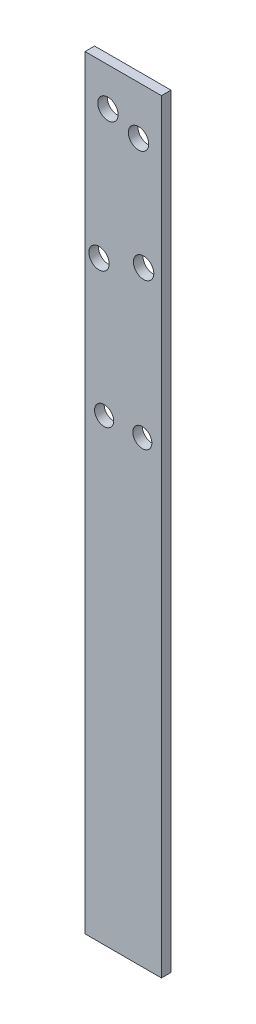
ISO-10303-21;
HEADER;
FILE_DESCRIPTION(('STEP AP214'),'2;1');
FILE_NAME('part.step','',(''),(''),'','','');
FILE_SCHEMA(('AUTOMOTIVE_DESIGN { 1 0 10303 214 1 1 1 1 }'));
ENDSEC;
DATA;
#1=APPLICATION_CONTEXT('core data for automotive mechanical design processes');
#2=APPLICATION_PROTOCOL_DEFINITION('international standard','automotive_design',2000,#1);
#3=PRODUCT_CONTEXT('',#1,'mechanical');
#4=PRODUCT('Part','Part','',(#3));
#5=PRODUCT_RELATED_PRODUCT_CATEGORY('part','',(#4));
#6=PRODUCT_DEFINITION_FORMATION('','',#4);
#7=PRODUCT_DEFINITION_CONTEXT('part definition',#1,'design');
#8=PRODUCT_DEFINITION('design','',#6,#7);
#9=PRODUCT_DEFINITION_SHAPE('','',#8);
#10=(LENGTH_UNIT() NAMED_UNIT(*) SI_UNIT(.MILLI.,.METRE.));
#11=(NAMED_UNIT(*) PLANE_ANGLE_UNIT() SI_UNIT($,.RADIAN.));
#12=(NAMED_UNIT(*) SI_UNIT($,.STERADIAN.) SOLID_ANGLE_UNIT());
#13=UNCERTAINTY_MEASURE_WITH_UNIT(LENGTH_MEASURE(1.E-05),#10,'distance_accuracy_value','');
#14=(GEOMETRIC_REPRESENTATION_CONTEXT(3) GLOBAL_UNCERTAINTY_ASSIGNED_CONTEXT((#13)) GLOBAL_UNIT_ASSIGNED_CONTEXT((#10,
#11,#12)) REPRESENTATION_CONTEXT('',''));
#15=CARTESIAN_POINT('',(0.,0.,0.));
#16=DIRECTION('',(0.,0.,1.));
#17=DIRECTION('',(1.,0.,0.));
#18=AXIS2_PLACEMENT_3D('',#15,#16,#17);
#19=CARTESIAN_POINT('',(0.,0.,4.7625));
#20=DIRECTION('',(0.,0.,1.));
#21=DIRECTION('',(1.,0.,0.));
#22=AXIS2_PLACEMENT_3D('',#19,#20,#21);
#23=PLANE('',#22);
#24=CARTESIAN_POINT('',(6.98500000000002,-85.725,4.7625));
#25=DIRECTION('',(0.,0.,1.));
#26=DIRECTION('',(1.,0.,0.));
#27=AXIS2_PLACEMENT_3D('',#24,#25,#26);
#28=CIRCLE('',#27,5.08000000000001);
#29=CARTESIAN_POINT('',(1.90500000000002,-85.725,4.7625));
#30=VERTEX_POINT('',#29);
#31=EDGE_CURVE('E162',#30,#30,#28,.T.);
#32=ORIENTED_EDGE('',*,*,#31,.F.);
#33=EDGE_LOOP('',(#32));
#34=FACE_BOUND('',#33,.T.);
#35=CARTESIAN_POINT('',(11.43,-19.05,4.7625));
#36=DIRECTION('',(0.,0.,1.));
#37=DIRECTION('',(1.,0.,0.));
#38=AXIS2_PLACEMENT_3D('',#35,#36,#37);
#39=CIRCLE('',#38,5.08);
#40=CARTESIAN_POINT('',(6.35,-19.05,4.7625));
#41=VERTEX_POINT('',#40);
#42=EDGE_CURVE('E146',#41,#41,#39,.T.);
#43=ORIENTED_EDGE('',*,*,#42,.F.);
#44=EDGE_LOOP('',(#43));
#45=FACE_BOUND('',#44,.T.);
#46=CARTESIAN_POINT('',(9.52500000000001,-152.4,4.7625));
#47=DIRECTION('',(0.,0.,1.));
#48=DIRECTION('',(1.,0.,0.));
#49=AXIS2_PLACEMENT_3D('',#46,#47,#48);
#50=CIRCLE('',#49,4.7625);
#51=CARTESIAN_POINT('',(4.76250000000001,-152.4,4.7625));
#52=VERTEX_POINT('',#51);
#53=EDGE_CURVE('E116',#52,#52,#50,.T.);
#54=ORIENTED_EDGE('',*,*,#53,.F.);
#55=EDGE_LOOP('',(#54));
#56=FACE_BOUND('',#55,.T.);
#57=DIRECTION('',(0.,-1.,0.));
#58=VECTOR('',#57,1.);
#59=CARTESIAN_POINT('',(0.,0.,4.7625));
#60=LINE('',#59,#58);
#61=CARTESIAN_POINT('',(0.,0.,4.7625));
#62=VERTEX_POINT('',#61);
#63=CARTESIAN_POINT('',(0.,-381.,4.7625));
#64=VERTEX_POINT('',#63);
#65=EDGE_CURVE('E96',#62,#64,#60,.T.);
#66=ORIENTED_EDGE('',*,*,#65,.T.);
#67=DIRECTION('',(1.,0.,0.));
#68=VECTOR('',#67,1.);
#69=CARTESIAN_POINT('',(0.,-381.,4.7625));
#70=LINE('',#69,#68);
#71=CARTESIAN_POINT('',(38.1000000000001,-381.,4.7625));
#72=VERTEX_POINT('',#71);
#73=EDGE_CURVE('E91',#64,#72,#70,.T.);
#74=ORIENTED_EDGE('',*,*,#73,.T.);
#75=DIRECTION('',(0.,1.,0.));
#76=VECTOR('',#75,1.);
#77=CARTESIAN_POINT('',(38.1,0.,4.7625));
#78=LINE('',#77,#76);
#79=CARTESIAN_POINT('',(38.1,0.,4.7625));
#80=VERTEX_POINT('',#79);
#81=EDGE_CURVE('E94',#72,#80,#78,.T.);
#82=ORIENTED_EDGE('',*,*,#81,.T.);
#83=DIRECTION('',(-1.,0.,0.));
#84=VECTOR('',#83,1.);
#85=CARTESIAN_POINT('',(0.,0.,4.7625));
#86=LINE('',#85,#84);
#87=EDGE_CURVE('E61',#80,#62,#86,.T.);
#88=ORIENTED_EDGE('',*,*,#87,.T.);
#89=EDGE_LOOP('',(#66,#74,#82,#88));
#90=FACE_BOUND('',#89,.T.);
#91=CARTESIAN_POINT('',(28.575,-152.4,4.7625));
#92=DIRECTION('',(0.,0.,1.));
#93=DIRECTION('',(1.,0.,0.));
#94=AXIS2_PLACEMENT_3D('',#91,#92,#93);
#95=CIRCLE('',#94,4.7625);
#96=CARTESIAN_POINT('',(23.8125,-152.4,4.7625));
#97=VERTEX_POINT('',#96);
#98=EDGE_CURVE('E138',#97,#97,#95,.T.);
#99=ORIENTED_EDGE('',*,*,#98,.F.);
#100=EDGE_LOOP('',(#99));
#101=FACE_BOUND('',#100,.T.);
#102=CARTESIAN_POINT('',(26.67,-24.13,4.7625));
#103=DIRECTION('',(0.,0.,1.));
#104=DIRECTION('',(1.,0.,0.));
#105=AXIS2_PLACEMENT_3D('',#102,#103,#104);
#106=CIRCLE('',#105,5.08);
#107=CARTESIAN_POINT('',(21.59,-24.13,4.7625));
#108=VERTEX_POINT('',#107);
#109=EDGE_CURVE('E154',#108,#108,#106,.T.);
#110=ORIENTED_EDGE('',*,*,#109,.F.);
#111=EDGE_LOOP('',(#110));
#112=FACE_BOUND('',#111,.T.);
#113=CARTESIAN_POINT('',(29.21,-78.74,4.7625));
#114=DIRECTION('',(0.,0.,1.));
#115=DIRECTION('',(1.,0.,0.));
#116=AXIS2_PLACEMENT_3D('',#113,#114,#115);
#117=CIRCLE('',#116,5.08000000000001);
#118=CARTESIAN_POINT('',(24.13,-78.74,4.7625));
#119=VERTEX_POINT('',#118);
#120=EDGE_CURVE('E170',#119,#119,#117,.T.);
#121=ORIENTED_EDGE('',*,*,#120,.F.);
#122=EDGE_LOOP('',(#121));
#123=FACE_BOUND('',#122,.T.);
#124=ADVANCED_FACE('F43',(#34,#45,#56,#90,#101,#112,#123),#23,.T.);
#125=CARTESIAN_POINT('',(0.,0.,0.));
#126=DIRECTION('',(0.,0.,1.));
#127=DIRECTION('',(1.,0.,0.));
#128=AXIS2_PLACEMENT_3D('',#125,#126,#127);
#129=PLANE('',#128);
#130=DIRECTION('',(0.,-1.,0.));
#131=VECTOR('',#130,1.);
#132=CARTESIAN_POINT('',(0.,0.,0.));
#133=LINE('',#132,#131);
#134=CARTESIAN_POINT('',(0.,0.,0.));
#135=VERTEX_POINT('',#134);
#136=CARTESIAN_POINT('',(0.,-381.,0.));
#137=VERTEX_POINT('',#136);
#138=EDGE_CURVE('E112',#135,#137,#133,.T.);
#139=ORIENTED_EDGE('',*,*,#138,.F.);
#140=DIRECTION('',(-1.,0.,0.));
#141=VECTOR('',#140,1.);
#142=CARTESIAN_POINT('',(0.,0.,0.));
#143=LINE('',#142,#141);
#144=CARTESIAN_POINT('',(38.1,0.,0.));
#145=VERTEX_POINT('',#144);
#146=EDGE_CURVE('E84',#145,#135,#143,.T.);
#147=ORIENTED_EDGE('',*,*,#146,.F.);
#148=DIRECTION('',(0.,1.,0.));
#149=VECTOR('',#148,1.);
#150=CARTESIAN_POINT('',(38.1,0.,0.));
#151=LINE('',#150,#149);
#152=CARTESIAN_POINT('',(38.1000000000001,-381.,0.));
#153=VERTEX_POINT('',#152);
#154=EDGE_CURVE('E78',#153,#145,#151,.T.);
#155=ORIENTED_EDGE('',*,*,#154,.F.);
#156=DIRECTION('',(1.,0.,0.));
#157=VECTOR('',#156,1.);
#158=CARTESIAN_POINT('',(0.,-381.,0.));
#159=LINE('',#158,#157);
#160=EDGE_CURVE('E101',#137,#153,#159,.T.);
#161=ORIENTED_EDGE('',*,*,#160,.F.);
#162=EDGE_LOOP('',(#139,#147,#155,#161));
#163=FACE_BOUND('',#162,.T.);
#164=CARTESIAN_POINT('',(9.52500000000001,-152.4,0.));
#165=DIRECTION('',(0.,0.,1.));
#166=DIRECTION('',(1.,0.,0.));
#167=AXIS2_PLACEMENT_3D('',#164,#165,#166);
#168=CIRCLE('',#167,4.7625);
#169=CARTESIAN_POINT('',(4.76250000000001,-152.4,0.));
#170=VERTEX_POINT('',#169);
#171=EDGE_CURVE('E134',#170,#170,#168,.T.);
#172=ORIENTED_EDGE('',*,*,#171,.T.);
#173=EDGE_LOOP('',(#172));
#174=FACE_BOUND('',#173,.T.);
#175=CARTESIAN_POINT('',(28.575,-152.4,0.));
#176=DIRECTION('',(0.,0.,1.));
#177=DIRECTION('',(1.,0.,0.));
#178=AXIS2_PLACEMENT_3D('',#175,#176,#177);
#179=CIRCLE('',#178,4.7625);
#180=CARTESIAN_POINT('',(23.8125,-152.4,0.));
#181=VERTEX_POINT('',#180);
#182=EDGE_CURVE('E142',#181,#181,#179,.T.);
#183=ORIENTED_EDGE('',*,*,#182,.T.);
#184=EDGE_LOOP('',(#183));
#185=FACE_BOUND('',#184,.T.);
#186=CARTESIAN_POINT('',(11.43,-19.05,0.));
#187=DIRECTION('',(0.,0.,1.));
#188=DIRECTION('',(1.,0.,0.));
#189=AXIS2_PLACEMENT_3D('',#186,#187,#188);
#190=CIRCLE('',#189,5.08);
#191=CARTESIAN_POINT('',(6.35,-19.05,0.));
#192=VERTEX_POINT('',#191);
#193=EDGE_CURVE('E150',#192,#192,#190,.T.);
#194=ORIENTED_EDGE('',*,*,#193,.T.);
#195=EDGE_LOOP('',(#194));
#196=FACE_BOUND('',#195,.T.);
#197=CARTESIAN_POINT('',(26.67,-24.13,0.));
#198=DIRECTION('',(0.,0.,1.));
#199=DIRECTION('',(1.,0.,0.));
#200=AXIS2_PLACEMENT_3D('',#197,#198,#199);
#201=CIRCLE('',#200,5.08);
#202=CARTESIAN_POINT('',(21.59,-24.13,0.));
#203=VERTEX_POINT('',#202);
#204=EDGE_CURVE('E158',#203,#203,#201,.T.);
#205=ORIENTED_EDGE('',*,*,#204,.T.);
#206=EDGE_LOOP('',(#205));
#207=FACE_BOUND('',#206,.T.);
#208=CARTESIAN_POINT('',(6.98500000000002,-85.725,0.));
#209=DIRECTION('',(0.,0.,1.));
#210=DIRECTION('',(1.,0.,0.));
#211=AXIS2_PLACEMENT_3D('',#208,#209,#210);
#212=CIRCLE('',#211,5.08000000000001);
#213=CARTESIAN_POINT('',(1.90500000000002,-85.725,0.));
#214=VERTEX_POINT('',#213);
#215=EDGE_CURVE('E166',#214,#214,#212,.T.);
#216=ORIENTED_EDGE('',*,*,#215,.T.);
#217=EDGE_LOOP('',(#216));
#218=FACE_BOUND('',#217,.T.);
#219=CARTESIAN_POINT('',(29.21,-78.74,0.));
#220=DIRECTION('',(0.,0.,1.));
#221=DIRECTION('',(1.,0.,0.));
#222=AXIS2_PLACEMENT_3D('',#219,#220,#221);
#223=CIRCLE('',#222,5.08000000000001);
#224=CARTESIAN_POINT('',(24.13,-78.74,0.));
#225=VERTEX_POINT('',#224);
#226=EDGE_CURVE('E174',#225,#225,#223,.T.);
#227=ORIENTED_EDGE('',*,*,#226,.T.);
#228=EDGE_LOOP('',(#227));
#229=FACE_BOUND('',#228,.T.);
#230=ADVANCED_FACE('F129',(#163,#174,#185,#196,#207,#218,#229),#129,.F.);
#231=CARTESIAN_POINT('',(0.,0.,4.7625));
#232=DIRECTION('',(1.,0.,0.));
#233=DIRECTION('',(0.,1.,0.));
#234=AXIS2_PLACEMENT_3D('',#231,#232,#233);
#235=PLANE('',#234);
#236=ORIENTED_EDGE('',*,*,#138,.T.);
#237=DIRECTION('',(0.,0.,-1.));
#238=VECTOR('',#237,1.);
#239=CARTESIAN_POINT('',(0.,-381.,4.7625));
#240=LINE('',#239,#238);
#241=EDGE_CURVE('E11',#64,#137,#240,.T.);
#242=ORIENTED_EDGE('',*,*,#241,.F.);
#243=ORIENTED_EDGE('',*,*,#65,.F.);
#244=DIRECTION('',(0.,0.,-1.));
#245=VECTOR('',#244,1.);
#246=CARTESIAN_POINT('',(0.,0.,4.7625));
#247=LINE('',#246,#245);
#248=EDGE_CURVE('E108',#62,#135,#247,.T.);
#249=ORIENTED_EDGE('',*,*,#248,.T.);
#250=EDGE_LOOP('',(#236,#242,#243,#249));
#251=FACE_BOUND('',#250,.T.);
#252=ADVANCED_FACE('F45',(#251),#235,.F.);
#253=CARTESIAN_POINT('',(0.,-381.,4.7625));
#254=DIRECTION('',(0.,1.,0.));
#255=DIRECTION('',(0.,0.,1.));
#256=AXIS2_PLACEMENT_3D('',#253,#254,#255);
#257=PLANE('',#256);
#258=ORIENTED_EDGE('',*,*,#160,.T.);
#259=DIRECTION('',(0.,0.,-1.));
#260=VECTOR('',#259,1.);
#261=CARTESIAN_POINT('',(38.1000000000001,-381.,4.7625));
#262=LINE('',#261,#260);
#263=EDGE_CURVE('E53',#72,#153,#262,.T.);
#264=ORIENTED_EDGE('',*,*,#263,.F.);
#265=ORIENTED_EDGE('',*,*,#73,.F.);
#266=ORIENTED_EDGE('',*,*,#241,.T.);
#267=EDGE_LOOP('',(#258,#264,#265,#266));
#268=FACE_BOUND('',#267,.T.);
#269=ADVANCED_FACE('F100',(#268),#257,.F.);
#270=CARTESIAN_POINT('',(38.1,0.,4.7625));
#271=DIRECTION('',(-1.,0.,0.));
#272=DIRECTION('',(0.,-1.,0.));
#273=AXIS2_PLACEMENT_3D('',#270,#271,#272);
#274=PLANE('',#273);
#275=ORIENTED_EDGE('',*,*,#154,.T.);
#276=DIRECTION('',(0.,0.,-1.));
#277=VECTOR('',#276,1.);
#278=CARTESIAN_POINT('',(38.1,0.,4.7625));
#279=LINE('',#278,#277);
#280=EDGE_CURVE('E103',#80,#145,#279,.T.);
#281=ORIENTED_EDGE('',*,*,#280,.F.);
#282=ORIENTED_EDGE('',*,*,#81,.F.);
#283=ORIENTED_EDGE('',*,*,#263,.T.);
#284=EDGE_LOOP('',(#275,#281,#282,#283));
#285=FACE_BOUND('',#284,.T.);
#286=ADVANCED_FACE('F104',(#285),#274,.F.);
#287=CARTESIAN_POINT('',(0.,0.,4.7625));
#288=DIRECTION('',(0.,-1.,0.));
#289=DIRECTION('',(0.,0.,-1.));
#290=AXIS2_PLACEMENT_3D('',#287,#288,#289);
#291=PLANE('',#290);
#292=ORIENTED_EDGE('',*,*,#146,.T.);
#293=ORIENTED_EDGE('',*,*,#248,.F.);
#294=ORIENTED_EDGE('',*,*,#87,.F.);
#295=ORIENTED_EDGE('',*,*,#280,.T.);
#296=EDGE_LOOP('',(#292,#293,#294,#295));
#297=FACE_BOUND('',#296,.T.);
#298=ADVANCED_FACE('F126',(#297),#291,.F.);
#299=CARTESIAN_POINT('',(9.52500000000001,-152.4,4.7625));
#300=DIRECTION('',(0.,0.,-1.));
#301=DIRECTION('',(-1.,0.,0.));
#302=AXIS2_PLACEMENT_3D('',#299,#300,#301);
#303=CYLINDRICAL_SURFACE('',#302,4.7625);
#304=CARTESIAN_POINT('',(4.76250000000001,-152.4,4.7625));
#305=CARTESIAN_POINT('',(4.76250000000001,-152.4,4.712890625));
#306=CARTESIAN_POINT('',(4.76250000000001,-152.4,4.66328125));
#307=CARTESIAN_POINT('',(4.76250000000001,-152.4,4.5640625));
#308=CARTESIAN_POINT('',(4.76250000000001,-152.4,4.514453125));
#309=CARTESIAN_POINT('',(4.76250000000001,-152.4,4.415234375));
#310=CARTESIAN_POINT('',(4.76250000000001,-152.4,4.365625));
#311=CARTESIAN_POINT('',(4.76250000000001,-152.4,4.26640625));
#312=CARTESIAN_POINT('',(4.76250000000001,-152.4,4.216796875));
#313=CARTESIAN_POINT('',(4.76250000000001,-152.4,4.117578125));
#314=CARTESIAN_POINT('',(4.76250000000001,-152.4,4.06796875));
#315=CARTESIAN_POINT('',(4.76250000000001,-152.4,3.96875));
#316=CARTESIAN_POINT('',(4.76250000000001,-152.4,3.919140625));
#317=CARTESIAN_POINT('',(4.76250000000001,-152.4,3.819921875));
#318=CARTESIAN_POINT('',(4.76250000000001,-152.4,3.7703125));
#319=CARTESIAN_POINT('',(4.76250000000001,-152.4,3.67109375));
#320=CARTESIAN_POINT('',(4.76250000000001,-152.4,3.621484375));
#321=CARTESIAN_POINT('',(4.76250000000001,-152.4,3.522265625));
#322=CARTESIAN_POINT('',(4.76250000000001,-152.4,3.47265625));
#323=CARTESIAN_POINT('',(4.76250000000001,-152.4,3.3734375));
#324=CARTESIAN_POINT('',(4.76250000000001,-152.4,3.323828125));
#325=CARTESIAN_POINT('',(4.76250000000001,-152.4,3.224609375));
#326=CARTESIAN_POINT('',(4.76250000000001,-152.4,3.175));
#327=CARTESIAN_POINT('',(4.76250000000001,-152.4,3.07578125));
#328=CARTESIAN_POINT('',(4.76250000000001,-152.4,3.026171875));
#329=CARTESIAN_POINT('',(4.76250000000001,-152.4,2.926953125));
#330=CARTESIAN_POINT('',(4.76250000000001,-152.4,2.87734375));
#331=CARTESIAN_POINT('',(4.76250000000001,-152.4,2.778125));
#332=CARTESIAN_POINT('',(4.76250000000001,-152.4,2.728515625));
#333=CARTESIAN_POINT('',(4.76250000000001,-152.4,2.629296875));
#334=CARTESIAN_POINT('',(4.76250000000001,-152.4,2.5796875));
#335=CARTESIAN_POINT('',(4.76250000000001,-152.4,2.48046875));
#336=CARTESIAN_POINT('',(4.76250000000001,-152.4,2.430859375));
#337=CARTESIAN_POINT('',(4.76250000000001,-152.4,2.331640625));
#338=CARTESIAN_POINT('',(4.76250000000001,-152.4,2.28203125));
#339=CARTESIAN_POINT('',(4.76250000000001,-152.4,2.1828125));
#340=CARTESIAN_POINT('',(4.76250000000001,-152.4,2.133203125));
#341=CARTESIAN_POINT('',(4.76250000000001,-152.4,2.033984375));
#342=CARTESIAN_POINT('',(4.76250000000001,-152.4,1.984375));
#343=CARTESIAN_POINT('',(4.76250000000001,-152.4,1.88515625));
#344=CARTESIAN_POINT('',(4.76250000000001,-152.4,1.835546875));
#345=CARTESIAN_POINT('',(4.76250000000001,-152.4,1.736328125));
#346=CARTESIAN_POINT('',(4.76250000000001,-152.4,1.68671875));
#347=CARTESIAN_POINT('',(4.76250000000001,-152.4,1.5875));
#348=CARTESIAN_POINT('',(4.76250000000001,-152.4,1.537890625));
#349=CARTESIAN_POINT('',(4.76250000000001,-152.4,1.438671875));
#350=CARTESIAN_POINT('',(4.76250000000001,-152.4,1.3890625));
#351=CARTESIAN_POINT('',(4.76250000000001,-152.4,1.28984375));
#352=CARTESIAN_POINT('',(4.76250000000001,-152.4,1.240234375));
#353=CARTESIAN_POINT('',(4.76250000000001,-152.4,1.141015625));
#354=CARTESIAN_POINT('',(4.76250000000001,-152.4,1.09140625));
#355=CARTESIAN_POINT('',(4.76250000000001,-152.4,0.992187499999999));
#356=CARTESIAN_POINT('',(4.76250000000001,-152.4,0.942578124999999));
#357=CARTESIAN_POINT('',(4.76250000000001,-152.4,0.843359375));
#358=CARTESIAN_POINT('',(4.76250000000001,-152.4,0.79375));
#359=CARTESIAN_POINT('',(4.76250000000001,-152.4,0.69453125));
#360=CARTESIAN_POINT('',(4.76250000000001,-152.4,0.644921875));
#361=CARTESIAN_POINT('',(4.76250000000001,-152.4,0.545703125));
#362=CARTESIAN_POINT('',(4.76250000000001,-152.4,0.49609375));
#363=CARTESIAN_POINT('',(4.76250000000001,-152.4,0.396875));
#364=CARTESIAN_POINT('',(4.76250000000001,-152.4,0.347265625));
#365=CARTESIAN_POINT('',(4.76250000000001,-152.4,0.248046875));
#366=CARTESIAN_POINT('',(4.76250000000001,-152.4,0.1984375));
#367=CARTESIAN_POINT('',(4.76250000000001,-152.4,0.09921875));
#368=CARTESIAN_POINT('',(4.76250000000001,-152.4,0.049609375));
#369=CARTESIAN_POINT('',(4.76250000000001,-152.4,0.));
#370=B_SPLINE_CURVE_WITH_KNOTS('',3,(#304,#305,#306,#307,#308,#309,#310,#311,#312,#313,#314,
#315,#316,#317,#318,#319,#320,#321,#322,#323,#324,#325,#326,#327,#328,#329,#330,#331,#332,#333,
#334,#335,#336,#337,#338,#339,#340,#341,#342,#343,#344,#345,#346,#347,#348,#349,#350,#351,#352,
#353,#354,#355,#356,#357,#358,#359,#360,#361,#362,#363,#364,#365,#366,#367,#368,#369),
.UNSPECIFIED.,.F.,.F.,(4,2,2,2,2,2,2,2,2,2,2,2,2,2,2,2,2,2,2,2,2,2,2,2,2,2,2,2,2,2,2,2,4),(0.,
0.148828125,0.29765625,0.446484375,0.5953125,0.744140625,0.892968750000001,1.041796875,1.190625,
1.339453125,1.48828125,1.637109375,1.7859375,1.934765625,2.08359375,2.232421875,2.38125,
2.530078125,2.67890625,2.827734375,2.9765625,3.125390625,3.27421875,3.423046875,3.571875,
3.720703125,3.86953125,4.018359375,4.1671875,4.316015625,4.46484375,4.613671875,4.7625),.UNSPECIFIED.);
#371=EDGE_CURVE('BSEAM195',#52,#170,#370,.T.);
#372=ORIENTED_EDGE('',*,*,#53,.T.);
#373=ORIENTED_EDGE('',*,*,#171,.F.);
#374=ORIENTED_EDGE('',*,*,#371,.T.);
#375=ORIENTED_EDGE('',*,*,#371,.F.);
#376=EDGE_LOOP('',(#372,#374,#373,#375));
#377=FACE_BOUND('',#376,.T.);
#378=ADVANCED_FACE('F195',(#377),#303,.F.);
#379=CARTESIAN_POINT('',(28.575,-152.4,4.7625));
#380=DIRECTION('',(0.,0.,-1.));
#381=DIRECTION('',(-1.,0.,0.));
#382=AXIS2_PLACEMENT_3D('',#379,#380,#381);
#383=CYLINDRICAL_SURFACE('',#382,4.7625);
#384=CARTESIAN_POINT('',(23.8125,-152.4,4.7625));
#385=CARTESIAN_POINT('',(23.8125,-152.4,4.712890625));
#386=CARTESIAN_POINT('',(23.8125,-152.4,4.66328125));
#387=CARTESIAN_POINT('',(23.8125,-152.4,4.5640625));
#388=CARTESIAN_POINT('',(23.8125,-152.4,4.514453125));
#389=CARTESIAN_POINT('',(23.8125,-152.4,4.415234375));
#390=CARTESIAN_POINT('',(23.8125,-152.4,4.365625));
#391=CARTESIAN_POINT('',(23.8125,-152.4,4.26640625));
#392=CARTESIAN_POINT('',(23.8125,-152.4,4.216796875));
#393=CARTESIAN_POINT('',(23.8125,-152.4,4.117578125));
#394=CARTESIAN_POINT('',(23.8125,-152.4,4.06796875));
#395=CARTESIAN_POINT('',(23.8125,-152.4,3.96875));
#396=CARTESIAN_POINT('',(23.8125,-152.4,3.919140625));
#397=CARTESIAN_POINT('',(23.8125,-152.4,3.819921875));
#398=CARTESIAN_POINT('',(23.8125,-152.4,3.7703125));
#399=CARTESIAN_POINT('',(23.8125,-152.4,3.67109375));
#400=CARTESIAN_POINT('',(23.8125,-152.4,3.621484375));
#401=CARTESIAN_POINT('',(23.8125,-152.4,3.522265625));
#402=CARTESIAN_POINT('',(23.8125,-152.4,3.47265625));
#403=CARTESIAN_POINT('',(23.8125,-152.4,3.3734375));
#404=CARTESIAN_POINT('',(23.8125,-152.4,3.323828125));
#405=CARTESIAN_POINT('',(23.8125,-152.4,3.224609375));
#406=CARTESIAN_POINT('',(23.8125,-152.4,3.175));
#407=CARTESIAN_POINT('',(23.8125,-152.4,3.07578125));
#408=CARTESIAN_POINT('',(23.8125,-152.4,3.026171875));
#409=CARTESIAN_POINT('',(23.8125,-152.4,2.926953125));
#410=CARTESIAN_POINT('',(23.8125,-152.4,2.87734375));
#411=CARTESIAN_POINT('',(23.8125,-152.4,2.778125));
#412=CARTESIAN_POINT('',(23.8125,-152.4,2.728515625));
#413=CARTESIAN_POINT('',(23.8125,-152.4,2.629296875));
#414=CARTESIAN_POINT('',(23.8125,-152.4,2.5796875));
#415=CARTESIAN_POINT('',(23.8125,-152.4,2.48046875));
#416=CARTESIAN_POINT('',(23.8125,-152.4,2.430859375));
#417=CARTESIAN_POINT('',(23.8125,-152.4,2.331640625));
#418=CARTESIAN_POINT('',(23.8125,-152.4,2.28203125));
#419=CARTESIAN_POINT('',(23.8125,-152.4,2.1828125));
#420=CARTESIAN_POINT('',(23.8125,-152.4,2.133203125));
#421=CARTESIAN_POINT('',(23.8125,-152.4,2.033984375));
#422=CARTESIAN_POINT('',(23.8125,-152.4,1.984375));
#423=CARTESIAN_POINT('',(23.8125,-152.4,1.88515625));
#424=CARTESIAN_POINT('',(23.8125,-152.4,1.835546875));
#425=CARTESIAN_POINT('',(23.8125,-152.4,1.736328125));
#426=CARTESIAN_POINT('',(23.8125,-152.4,1.68671875));
#427=CARTESIAN_POINT('',(23.8125,-152.4,1.5875));
#428=CARTESIAN_POINT('',(23.8125,-152.4,1.537890625));
#429=CARTESIAN_POINT('',(23.8125,-152.4,1.438671875));
#430=CARTESIAN_POINT('',(23.8125,-152.4,1.3890625));
#431=CARTESIAN_POINT('',(23.8125,-152.4,1.28984375));
#432=CARTESIAN_POINT('',(23.8125,-152.4,1.240234375));
#433=CARTESIAN_POINT('',(23.8125,-152.4,1.141015625));
#434=CARTESIAN_POINT('',(23.8125,-152.4,1.09140625));
#435=CARTESIAN_POINT('',(23.8125,-152.4,0.992187499999999));
#436=CARTESIAN_POINT('',(23.8125,-152.4,0.942578124999999));
#437=CARTESIAN_POINT('',(23.8125,-152.4,0.843359375));
#438=CARTESIAN_POINT('',(23.8125,-152.4,0.79375));
#439=CARTESIAN_POINT('',(23.8125,-152.4,0.69453125));
#440=CARTESIAN_POINT('',(23.8125,-152.4,0.644921875));
#441=CARTESIAN_POINT('',(23.8125,-152.4,0.545703125));
#442=CARTESIAN_POINT('',(23.8125,-152.4,0.49609375));
#443=CARTESIAN_POINT('',(23.8125,-152.4,0.396875));
#444=CARTESIAN_POINT('',(23.8125,-152.4,0.347265625));
#445=CARTESIAN_POINT('',(23.8125,-152.4,0.248046875));
#446=CARTESIAN_POINT('',(23.8125,-152.4,0.1984375));
#447=CARTESIAN_POINT('',(23.8125,-152.4,0.09921875));
#448=CARTESIAN_POINT('',(23.8125,-152.4,0.049609375));
#449=CARTESIAN_POINT('',(23.8125,-152.4,0.));
#450=B_SPLINE_CURVE_WITH_KNOTS('',3,(#384,#385,#386,#387,#388,#389,#390,#391,#392,#393,#394,
#395,#396,#397,#398,#399,#400,#401,#402,#403,#404,#405,#406,#407,#408,#409,#410,#411,#412,#413,
#414,#415,#416,#417,#418,#419,#420,#421,#422,#423,#424,#425,#426,#427,#428,#429,#430,#431,#432,
#433,#434,#435,#436,#437,#438,#439,#440,#441,#442,#443,#444,#445,#446,#447,#448,#449),
.UNSPECIFIED.,.F.,.F.,(4,2,2,2,2,2,2,2,2,2,2,2,2,2,2,2,2,2,2,2,2,2,2,2,2,2,2,2,2,2,2,2,4),(0.,
0.148828125,0.29765625,0.446484375,0.5953125,0.744140625,0.892968750000001,1.041796875,1.190625,
1.339453125,1.48828125,1.637109375,1.7859375,1.934765625,2.08359375,2.232421875,2.38125,
2.530078125,2.67890625,2.827734375,2.9765625,3.125390625,3.27421875,3.423046875,3.571875,
3.720703125,3.86953125,4.018359375,4.1671875,4.316015625,4.46484375,4.613671875,4.7625),.UNSPECIFIED.);
#451=EDGE_CURVE('BSEAM249',#97,#181,#450,.T.);
#452=ORIENTED_EDGE('',*,*,#98,.T.);
#453=ORIENTED_EDGE('',*,*,#182,.F.);
#454=ORIENTED_EDGE('',*,*,#451,.T.);
#455=ORIENTED_EDGE('',*,*,#451,.F.);
#456=EDGE_LOOP('',(#452,#454,#453,#455));
#457=FACE_BOUND('',#456,.T.);
#458=ADVANCED_FACE('F249',(#457),#383,.F.);
#459=CARTESIAN_POINT('',(11.43,-19.05,4.7625));
#460=DIRECTION('',(0.,0.,-1.));
#461=DIRECTION('',(-1.,0.,0.));
#462=AXIS2_PLACEMENT_3D('',#459,#460,#461);
#463=CYLINDRICAL_SURFACE('',#462,5.08);
#464=CARTESIAN_POINT('',(6.35,-19.05,4.7625));
#465=CARTESIAN_POINT('',(6.35,-19.05,4.712890625));
#466=CARTESIAN_POINT('',(6.35,-19.05,4.66328125));
#467=CARTESIAN_POINT('',(6.35,-19.05,4.5640625));
#468=CARTESIAN_POINT('',(6.35,-19.05,4.514453125));
#469=CARTESIAN_POINT('',(6.35,-19.05,4.415234375));
#470=CARTESIAN_POINT('',(6.35,-19.05,4.365625));
#471=CARTESIAN_POINT('',(6.35,-19.05,4.26640625));
#472=CARTESIAN_POINT('',(6.35,-19.05,4.216796875));
#473=CARTESIAN_POINT('',(6.35,-19.05,4.117578125));
#474=CARTESIAN_POINT('',(6.35,-19.05,4.06796875));
#475=CARTESIAN_POINT('',(6.35,-19.05,3.96875));
#476=CARTESIAN_POINT('',(6.35,-19.05,3.919140625));
#477=CARTESIAN_POINT('',(6.35,-19.05,3.819921875));
#478=CARTESIAN_POINT('',(6.35,-19.05,3.7703125));
#479=CARTESIAN_POINT('',(6.35,-19.05,3.67109375));
#480=CARTESIAN_POINT('',(6.35,-19.05,3.621484375));
#481=CARTESIAN_POINT('',(6.35,-19.05,3.522265625));
#482=CARTESIAN_POINT('',(6.35,-19.05,3.47265625));
#483=CARTESIAN_POINT('',(6.35,-19.05,3.3734375));
#484=CARTESIAN_POINT('',(6.35,-19.05,3.323828125));
#485=CARTESIAN_POINT('',(6.35,-19.05,3.224609375));
#486=CARTESIAN_POINT('',(6.35,-19.05,3.175));
#487=CARTESIAN_POINT('',(6.35,-19.05,3.07578125));
#488=CARTESIAN_POINT('',(6.35,-19.05,3.026171875));
#489=CARTESIAN_POINT('',(6.35,-19.05,2.926953125));
#490=CARTESIAN_POINT('',(6.35,-19.05,2.87734375));
#491=CARTESIAN_POINT('',(6.35,-19.05,2.778125));
#492=CARTESIAN_POINT('',(6.35,-19.05,2.728515625));
#493=CARTESIAN_POINT('',(6.35,-19.05,2.629296875));
#494=CARTESIAN_POINT('',(6.35,-19.05,2.5796875));
#495=CARTESIAN_POINT('',(6.35,-19.05,2.48046875));
#496=CARTESIAN_POINT('',(6.35,-19.05,2.430859375));
#497=CARTESIAN_POINT('',(6.35,-19.05,2.331640625));
#498=CARTESIAN_POINT('',(6.35,-19.05,2.28203125));
#499=CARTESIAN_POINT('',(6.35,-19.05,2.1828125));
#500=CARTESIAN_POINT('',(6.35,-19.05,2.133203125));
#501=CARTESIAN_POINT('',(6.35,-19.05,2.033984375));
#502=CARTESIAN_POINT('',(6.35,-19.05,1.984375));
#503=CARTESIAN_POINT('',(6.35,-19.05,1.88515625));
#504=CARTESIAN_POINT('',(6.35,-19.05,1.835546875));
#505=CARTESIAN_POINT('',(6.35,-19.05,1.736328125));
#506=CARTESIAN_POINT('',(6.35,-19.05,1.68671875));
#507=CARTESIAN_POINT('',(6.35,-19.05,1.5875));
#508=CARTESIAN_POINT('',(6.35,-19.05,1.537890625));
#509=CARTESIAN_POINT('',(6.35,-19.05,1.438671875));
#510=CARTESIAN_POINT('',(6.35,-19.05,1.3890625));
#511=CARTESIAN_POINT('',(6.35,-19.05,1.28984375));
#512=CARTESIAN_POINT('',(6.35,-19.05,1.240234375));
#513=CARTESIAN_POINT('',(6.35,-19.05,1.141015625));
#514=CARTESIAN_POINT('',(6.35,-19.05,1.09140625));
#515=CARTESIAN_POINT('',(6.35,-19.05,0.992187499999999));
#516=CARTESIAN_POINT('',(6.35,-19.05,0.942578124999999));
#517=CARTESIAN_POINT('',(6.35,-19.05,0.843359375));
#518=CARTESIAN_POINT('',(6.35,-19.05,0.79375));
#519=CARTESIAN_POINT('',(6.35,-19.05,0.69453125));
#520=CARTESIAN_POINT('',(6.35,-19.05,0.644921875));
#521=CARTESIAN_POINT('',(6.35,-19.05,0.545703125));
#522=CARTESIAN_POINT('',(6.35,-19.05,0.49609375));
#523=CARTESIAN_POINT('',(6.35,-19.05,0.396875));
#524=CARTESIAN_POINT('',(6.35,-19.05,0.347265625));
#525=CARTESIAN_POINT('',(6.35,-19.05,0.248046875));
#526=CARTESIAN_POINT('',(6.35,-19.05,0.1984375));
#527=CARTESIAN_POINT('',(6.35,-19.05,0.09921875));
#528=CARTESIAN_POINT('',(6.35,-19.05,0.049609375));
#529=CARTESIAN_POINT('',(6.35,-19.05,0.));
#530=B_SPLINE_CURVE_WITH_KNOTS('',3,(#464,#465,#466,#467,#468,#469,#470,#471,#472,#473,#474,
#475,#476,#477,#478,#479,#480,#481,#482,#483,#484,#485,#486,#487,#488,#489,#490,#491,#492,#493,
#494,#495,#496,#497,#498,#499,#500,#501,#502,#503,#504,#505,#506,#507,#508,#509,#510,#511,#512,
#513,#514,#515,#516,#517,#518,#519,#520,#521,#522,#523,#524,#525,#526,#527,#528,#529),
.UNSPECIFIED.,.F.,.F.,(4,2,2,2,2,2,2,2,2,2,2,2,2,2,2,2,2,2,2,2,2,2,2,2,2,2,2,2,2,2,2,2,4),(0.,
0.148828125,0.29765625,0.446484375,0.5953125,0.744140625,0.892968750000001,1.041796875,1.190625,
1.339453125,1.48828125,1.637109375,1.7859375,1.934765625,2.08359375,2.232421875,2.38125,
2.530078125,2.67890625,2.827734375,2.9765625,3.125390625,3.27421875,3.423046875,3.571875,
3.720703125,3.86953125,4.018359375,4.1671875,4.316015625,4.46484375,4.613671875,4.7625),.UNSPECIFIED.);
#531=EDGE_CURVE('BSEAM258',#41,#192,#530,.T.);
#532=ORIENTED_EDGE('',*,*,#42,.T.);
#533=ORIENTED_EDGE('',*,*,#193,.F.);
#534=ORIENTED_EDGE('',*,*,#531,.T.);
#535=ORIENTED_EDGE('',*,*,#531,.F.);
#536=EDGE_LOOP('',(#532,#534,#533,#535));
#537=FACE_BOUND('',#536,.T.);
#538=ADVANCED_FACE('F258',(#537),#463,.F.);
#539=CARTESIAN_POINT('',(26.67,-24.13,4.7625));
#540=DIRECTION('',(0.,0.,-1.));
#541=DIRECTION('',(-1.,0.,0.));
#542=AXIS2_PLACEMENT_3D('',#539,#540,#541);
#543=CYLINDRICAL_SURFACE('',#542,5.08);
#544=CARTESIAN_POINT('',(21.59,-24.13,4.7625));
#545=CARTESIAN_POINT('',(21.59,-24.13,4.712890625));
#546=CARTESIAN_POINT('',(21.59,-24.13,4.66328125));
#547=CARTESIAN_POINT('',(21.59,-24.13,4.5640625));
#548=CARTESIAN_POINT('',(21.59,-24.13,4.514453125));
#549=CARTESIAN_POINT('',(21.59,-24.13,4.415234375));
#550=CARTESIAN_POINT('',(21.59,-24.13,4.365625));
#551=CARTESIAN_POINT('',(21.59,-24.13,4.26640625));
#552=CARTESIAN_POINT('',(21.59,-24.13,4.216796875));
#553=CARTESIAN_POINT('',(21.59,-24.13,4.117578125));
#554=CARTESIAN_POINT('',(21.59,-24.13,4.06796875));
#555=CARTESIAN_POINT('',(21.59,-24.13,3.96875));
#556=CARTESIAN_POINT('',(21.59,-24.13,3.919140625));
#557=CARTESIAN_POINT('',(21.59,-24.13,3.819921875));
#558=CARTESIAN_POINT('',(21.59,-24.13,3.7703125));
#559=CARTESIAN_POINT('',(21.59,-24.13,3.67109375));
#560=CARTESIAN_POINT('',(21.59,-24.13,3.621484375));
#561=CARTESIAN_POINT('',(21.59,-24.13,3.522265625));
#562=CARTESIAN_POINT('',(21.59,-24.13,3.47265625));
#563=CARTESIAN_POINT('',(21.59,-24.13,3.3734375));
#564=CARTESIAN_POINT('',(21.59,-24.13,3.323828125));
#565=CARTESIAN_POINT('',(21.59,-24.13,3.224609375));
#566=CARTESIAN_POINT('',(21.59,-24.13,3.175));
#567=CARTESIAN_POINT('',(21.59,-24.13,3.07578125));
#568=CARTESIAN_POINT('',(21.59,-24.13,3.026171875));
#569=CARTESIAN_POINT('',(21.59,-24.13,2.926953125));
#570=CARTESIAN_POINT('',(21.59,-24.13,2.87734375));
#571=CARTESIAN_POINT('',(21.59,-24.13,2.778125));
#572=CARTESIAN_POINT('',(21.59,-24.13,2.728515625));
#573=CARTESIAN_POINT('',(21.59,-24.13,2.629296875));
#574=CARTESIAN_POINT('',(21.59,-24.13,2.5796875));
#575=CARTESIAN_POINT('',(21.59,-24.13,2.48046875));
#576=CARTESIAN_POINT('',(21.59,-24.13,2.430859375));
#577=CARTESIAN_POINT('',(21.59,-24.13,2.331640625));
#578=CARTESIAN_POINT('',(21.59,-24.13,2.28203125));
#579=CARTESIAN_POINT('',(21.59,-24.13,2.1828125));
#580=CARTESIAN_POINT('',(21.59,-24.13,2.133203125));
#581=CARTESIAN_POINT('',(21.59,-24.13,2.033984375));
#582=CARTESIAN_POINT('',(21.59,-24.13,1.984375));
#583=CARTESIAN_POINT('',(21.59,-24.13,1.88515625));
#584=CARTESIAN_POINT('',(21.59,-24.13,1.835546875));
#585=CARTESIAN_POINT('',(21.59,-24.13,1.736328125));
#586=CARTESIAN_POINT('',(21.59,-24.13,1.68671875));
#587=CARTESIAN_POINT('',(21.59,-24.13,1.5875));
#588=CARTESIAN_POINT('',(21.59,-24.13,1.537890625));
#589=CARTESIAN_POINT('',(21.59,-24.13,1.438671875));
#590=CARTESIAN_POINT('',(21.59,-24.13,1.3890625));
#591=CARTESIAN_POINT('',(21.59,-24.13,1.28984375));
#592=CARTESIAN_POINT('',(21.59,-24.13,1.240234375));
#593=CARTESIAN_POINT('',(21.59,-24.13,1.141015625));
#594=CARTESIAN_POINT('',(21.59,-24.13,1.09140625));
#595=CARTESIAN_POINT('',(21.59,-24.13,0.992187499999999));
#596=CARTESIAN_POINT('',(21.59,-24.13,0.942578124999999));
#597=CARTESIAN_POINT('',(21.59,-24.13,0.843359375));
#598=CARTESIAN_POINT('',(21.59,-24.13,0.79375));
#599=CARTESIAN_POINT('',(21.59,-24.13,0.69453125));
#600=CARTESIAN_POINT('',(21.59,-24.13,0.644921875));
#601=CARTESIAN_POINT('',(21.59,-24.13,0.545703125));
#602=CARTESIAN_POINT('',(21.59,-24.13,0.49609375));
#603=CARTESIAN_POINT('',(21.59,-24.13,0.396875));
#604=CARTESIAN_POINT('',(21.59,-24.13,0.347265625));
#605=CARTESIAN_POINT('',(21.59,-24.13,0.248046875));
#606=CARTESIAN_POINT('',(21.59,-24.13,0.1984375));
#607=CARTESIAN_POINT('',(21.59,-24.13,0.09921875));
#608=CARTESIAN_POINT('',(21.59,-24.13,0.049609375));
#609=CARTESIAN_POINT('',(21.59,-24.13,0.));
#610=B_SPLINE_CURVE_WITH_KNOTS('',3,(#544,#545,#546,#547,#548,#549,#550,#551,#552,#553,#554,
#555,#556,#557,#558,#559,#560,#561,#562,#563,#564,#565,#566,#567,#568,#569,#570,#571,#572,#573,
#574,#575,#576,#577,#578,#579,#580,#581,#582,#583,#584,#585,#586,#587,#588,#589,#590,#591,#592,
#593,#594,#595,#596,#597,#598,#599,#600,#601,#602,#603,#604,#605,#606,#607,#608,#609),
.UNSPECIFIED.,.F.,.F.,(4,2,2,2,2,2,2,2,2,2,2,2,2,2,2,2,2,2,2,2,2,2,2,2,2,2,2,2,2,2,2,2,4),(0.,
0.148828125,0.29765625,0.446484375,0.5953125,0.744140625,0.892968750000001,1.041796875,1.190625,
1.339453125,1.48828125,1.637109375,1.7859375,1.934765625,2.08359375,2.232421875,2.38125,
2.530078125,2.67890625,2.827734375,2.9765625,3.125390625,3.27421875,3.423046875,3.571875,
3.720703125,3.86953125,4.018359375,4.1671875,4.316015625,4.46484375,4.613671875,4.7625),.UNSPECIFIED.);
#611=EDGE_CURVE('BSEAM267',#108,#203,#610,.T.);
#612=ORIENTED_EDGE('',*,*,#109,.T.);
#613=ORIENTED_EDGE('',*,*,#204,.F.);
#614=ORIENTED_EDGE('',*,*,#611,.T.);
#615=ORIENTED_EDGE('',*,*,#611,.F.);
#616=EDGE_LOOP('',(#612,#614,#613,#615));
#617=FACE_BOUND('',#616,.T.);
#618=ADVANCED_FACE('F267',(#617),#543,.F.);
#619=CARTESIAN_POINT('',(6.98500000000002,-85.725,4.7625));
#620=DIRECTION('',(0.,0.,-1.));
#621=DIRECTION('',(-1.,0.,0.));
#622=AXIS2_PLACEMENT_3D('',#619,#620,#621);
#623=CYLINDRICAL_SURFACE('',#622,5.08000000000001);
#624=CARTESIAN_POINT('',(1.90500000000002,-85.725,4.7625));
#625=CARTESIAN_POINT('',(1.90500000000002,-85.725,4.712890625));
#626=CARTESIAN_POINT('',(1.90500000000002,-85.725,4.66328125));
#627=CARTESIAN_POINT('',(1.90500000000002,-85.725,4.5640625));
#628=CARTESIAN_POINT('',(1.90500000000002,-85.725,4.514453125));
#629=CARTESIAN_POINT('',(1.90500000000002,-85.725,4.415234375));
#630=CARTESIAN_POINT('',(1.90500000000002,-85.725,4.365625));
#631=CARTESIAN_POINT('',(1.90500000000002,-85.725,4.26640625));
#632=CARTESIAN_POINT('',(1.90500000000002,-85.725,4.216796875));
#633=CARTESIAN_POINT('',(1.90500000000002,-85.725,4.117578125));
#634=CARTESIAN_POINT('',(1.90500000000002,-85.725,4.06796875));
#635=CARTESIAN_POINT('',(1.90500000000002,-85.725,3.96875));
#636=CARTESIAN_POINT('',(1.90500000000002,-85.725,3.919140625));
#637=CARTESIAN_POINT('',(1.90500000000002,-85.725,3.819921875));
#638=CARTESIAN_POINT('',(1.90500000000002,-85.725,3.7703125));
#639=CARTESIAN_POINT('',(1.90500000000002,-85.725,3.67109375));
#640=CARTESIAN_POINT('',(1.90500000000002,-85.725,3.621484375));
#641=CARTESIAN_POINT('',(1.90500000000002,-85.725,3.522265625));
#642=CARTESIAN_POINT('',(1.90500000000002,-85.725,3.47265625));
#643=CARTESIAN_POINT('',(1.90500000000002,-85.725,3.3734375));
#644=CARTESIAN_POINT('',(1.90500000000002,-85.725,3.323828125));
#645=CARTESIAN_POINT('',(1.90500000000002,-85.725,3.224609375));
#646=CARTESIAN_POINT('',(1.90500000000002,-85.725,3.175));
#647=CARTESIAN_POINT('',(1.90500000000002,-85.725,3.07578125));
#648=CARTESIAN_POINT('',(1.90500000000002,-85.725,3.026171875));
#649=CARTESIAN_POINT('',(1.90500000000002,-85.725,2.926953125));
#650=CARTESIAN_POINT('',(1.90500000000002,-85.725,2.87734375));
#651=CARTESIAN_POINT('',(1.90500000000002,-85.725,2.778125));
#652=CARTESIAN_POINT('',(1.90500000000002,-85.725,2.728515625));
#653=CARTESIAN_POINT('',(1.90500000000002,-85.725,2.629296875));
#654=CARTESIAN_POINT('',(1.90500000000002,-85.725,2.5796875));
#655=CARTESIAN_POINT('',(1.90500000000002,-85.725,2.48046875));
#656=CARTESIAN_POINT('',(1.90500000000002,-85.725,2.430859375));
#657=CARTESIAN_POINT('',(1.90500000000002,-85.725,2.331640625));
#658=CARTESIAN_POINT('',(1.90500000000002,-85.725,2.28203125));
#659=CARTESIAN_POINT('',(1.90500000000002,-85.725,2.1828125));
#660=CARTESIAN_POINT('',(1.90500000000002,-85.725,2.133203125));
#661=CARTESIAN_POINT('',(1.90500000000002,-85.725,2.033984375));
#662=CARTESIAN_POINT('',(1.90500000000002,-85.725,1.984375));
#663=CARTESIAN_POINT('',(1.90500000000002,-85.725,1.88515625));
#664=CARTESIAN_POINT('',(1.90500000000002,-85.725,1.835546875));
#665=CARTESIAN_POINT('',(1.90500000000002,-85.725,1.736328125));
#666=CARTESIAN_POINT('',(1.90500000000002,-85.725,1.68671875));
#667=CARTESIAN_POINT('',(1.90500000000002,-85.725,1.5875));
#668=CARTESIAN_POINT('',(1.90500000000002,-85.725,1.537890625));
#669=CARTESIAN_POINT('',(1.90500000000002,-85.725,1.438671875));
#670=CARTESIAN_POINT('',(1.90500000000002,-85.725,1.3890625));
#671=CARTESIAN_POINT('',(1.90500000000002,-85.725,1.28984375));
#672=CARTESIAN_POINT('',(1.90500000000002,-85.725,1.240234375));
#673=CARTESIAN_POINT('',(1.90500000000002,-85.725,1.141015625));
#674=CARTESIAN_POINT('',(1.90500000000002,-85.725,1.09140625));
#675=CARTESIAN_POINT('',(1.90500000000002,-85.725,0.992187499999999));
#676=CARTESIAN_POINT('',(1.90500000000002,-85.725,0.942578124999999));
#677=CARTESIAN_POINT('',(1.90500000000002,-85.725,0.843359375));
#678=CARTESIAN_POINT('',(1.90500000000002,-85.725,0.79375));
#679=CARTESIAN_POINT('',(1.90500000000002,-85.725,0.69453125));
#680=CARTESIAN_POINT('',(1.90500000000002,-85.725,0.644921875));
#681=CARTESIAN_POINT('',(1.90500000000002,-85.725,0.545703125));
#682=CARTESIAN_POINT('',(1.90500000000002,-85.725,0.49609375));
#683=CARTESIAN_POINT('',(1.90500000000002,-85.725,0.396875));
#684=CARTESIAN_POINT('',(1.90500000000002,-85.725,0.347265625));
#685=CARTESIAN_POINT('',(1.90500000000002,-85.725,0.248046875));
#686=CARTESIAN_POINT('',(1.90500000000002,-85.725,0.1984375));
#687=CARTESIAN_POINT('',(1.90500000000002,-85.725,0.09921875));
#688=CARTESIAN_POINT('',(1.90500000000002,-85.725,0.049609375));
#689=CARTESIAN_POINT('',(1.90500000000002,-85.725,0.));
#690=B_SPLINE_CURVE_WITH_KNOTS('',3,(#624,#625,#626,#627,#628,#629,#630,#631,#632,#633,#634,
#635,#636,#637,#638,#639,#640,#641,#642,#643,#644,#645,#646,#647,#648,#649,#650,#651,#652,#653,
#654,#655,#656,#657,#658,#659,#660,#661,#662,#663,#664,#665,#666,#667,#668,#669,#670,#671,#672,
#673,#674,#675,#676,#677,#678,#679,#680,#681,#682,#683,#684,#685,#686,#687,#688,#689),
.UNSPECIFIED.,.F.,.F.,(4,2,2,2,2,2,2,2,2,2,2,2,2,2,2,2,2,2,2,2,2,2,2,2,2,2,2,2,2,2,2,2,4),(0.,
0.148828125,0.29765625,0.446484375,0.5953125,0.744140625,0.892968750000001,1.041796875,1.190625,
1.339453125,1.48828125,1.637109375,1.7859375,1.934765625,2.08359375,2.232421875,2.38125,
2.530078125,2.67890625,2.827734375,2.9765625,3.125390625,3.27421875,3.423046875,3.571875,
3.720703125,3.86953125,4.018359375,4.1671875,4.316015625,4.46484375,4.613671875,4.7625),.UNSPECIFIED.);
#691=EDGE_CURVE('BSEAM277',#30,#214,#690,.T.);
#692=ORIENTED_EDGE('',*,*,#31,.T.);
#693=ORIENTED_EDGE('',*,*,#215,.F.);
#694=ORIENTED_EDGE('',*,*,#691,.T.);
#695=ORIENTED_EDGE('',*,*,#691,.F.);
#696=EDGE_LOOP('',(#692,#694,#693,#695));
#697=FACE_BOUND('',#696,.T.);
#698=ADVANCED_FACE('F277',(#697),#623,.F.);
#699=CARTESIAN_POINT('',(29.21,-78.74,4.7625));
#700=DIRECTION('',(0.,0.,-1.));
#701=DIRECTION('',(-1.,0.,0.));
#702=AXIS2_PLACEMENT_3D('',#699,#700,#701);
#703=CYLINDRICAL_SURFACE('',#702,5.08000000000001);
#704=CARTESIAN_POINT('',(24.13,-78.74,4.7625));
#705=CARTESIAN_POINT('',(24.13,-78.74,4.712890625));
#706=CARTESIAN_POINT('',(24.13,-78.74,4.66328125));
#707=CARTESIAN_POINT('',(24.13,-78.74,4.5640625));
#708=CARTESIAN_POINT('',(24.13,-78.74,4.514453125));
#709=CARTESIAN_POINT('',(24.13,-78.74,4.415234375));
#710=CARTESIAN_POINT('',(24.13,-78.74,4.365625));
#711=CARTESIAN_POINT('',(24.13,-78.74,4.26640625));
#712=CARTESIAN_POINT('',(24.13,-78.74,4.216796875));
#713=CARTESIAN_POINT('',(24.13,-78.74,4.117578125));
#714=CARTESIAN_POINT('',(24.13,-78.74,4.06796875));
#715=CARTESIAN_POINT('',(24.13,-78.74,3.96875));
#716=CARTESIAN_POINT('',(24.13,-78.74,3.919140625));
#717=CARTESIAN_POINT('',(24.13,-78.74,3.819921875));
#718=CARTESIAN_POINT('',(24.13,-78.74,3.7703125));
#719=CARTESIAN_POINT('',(24.13,-78.74,3.67109375));
#720=CARTESIAN_POINT('',(24.13,-78.74,3.621484375));
#721=CARTESIAN_POINT('',(24.13,-78.74,3.522265625));
#722=CARTESIAN_POINT('',(24.13,-78.74,3.47265625));
#723=CARTESIAN_POINT('',(24.13,-78.74,3.3734375));
#724=CARTESIAN_POINT('',(24.13,-78.74,3.323828125));
#725=CARTESIAN_POINT('',(24.13,-78.74,3.224609375));
#726=CARTESIAN_POINT('',(24.13,-78.74,3.175));
#727=CARTESIAN_POINT('',(24.13,-78.74,3.07578125));
#728=CARTESIAN_POINT('',(24.13,-78.74,3.026171875));
#729=CARTESIAN_POINT('',(24.13,-78.74,2.926953125));
#730=CARTESIAN_POINT('',(24.13,-78.74,2.87734375));
#731=CARTESIAN_POINT('',(24.13,-78.74,2.778125));
#732=CARTESIAN_POINT('',(24.13,-78.74,2.728515625));
#733=CARTESIAN_POINT('',(24.13,-78.74,2.629296875));
#734=CARTESIAN_POINT('',(24.13,-78.74,2.5796875));
#735=CARTESIAN_POINT('',(24.13,-78.74,2.48046875));
#736=CARTESIAN_POINT('',(24.13,-78.74,2.430859375));
#737=CARTESIAN_POINT('',(24.13,-78.74,2.331640625));
#738=CARTESIAN_POINT('',(24.13,-78.74,2.28203125));
#739=CARTESIAN_POINT('',(24.13,-78.74,2.1828125));
#740=CARTESIAN_POINT('',(24.13,-78.74,2.133203125));
#741=CARTESIAN_POINT('',(24.13,-78.74,2.033984375));
#742=CARTESIAN_POINT('',(24.13,-78.74,1.984375));
#743=CARTESIAN_POINT('',(24.13,-78.74,1.88515625));
#744=CARTESIAN_POINT('',(24.13,-78.74,1.835546875));
#745=CARTESIAN_POINT('',(24.13,-78.74,1.736328125));
#746=CARTESIAN_POINT('',(24.13,-78.74,1.68671875));
#747=CARTESIAN_POINT('',(24.13,-78.74,1.5875));
#748=CARTESIAN_POINT('',(24.13,-78.74,1.537890625));
#749=CARTESIAN_POINT('',(24.13,-78.74,1.438671875));
#750=CARTESIAN_POINT('',(24.13,-78.74,1.3890625));
#751=CARTESIAN_POINT('',(24.13,-78.74,1.28984375));
#752=CARTESIAN_POINT('',(24.13,-78.74,1.240234375));
#753=CARTESIAN_POINT('',(24.13,-78.74,1.141015625));
#754=CARTESIAN_POINT('',(24.13,-78.74,1.09140625));
#755=CARTESIAN_POINT('',(24.13,-78.74,0.992187499999999));
#756=CARTESIAN_POINT('',(24.13,-78.74,0.942578124999999));
#757=CARTESIAN_POINT('',(24.13,-78.74,0.843359375));
#758=CARTESIAN_POINT('',(24.13,-78.74,0.79375));
#759=CARTESIAN_POINT('',(24.13,-78.74,0.69453125));
#760=CARTESIAN_POINT('',(24.13,-78.74,0.644921875));
#761=CARTESIAN_POINT('',(24.13,-78.74,0.545703125));
#762=CARTESIAN_POINT('',(24.13,-78.74,0.49609375));
#763=CARTESIAN_POINT('',(24.13,-78.74,0.396875));
#764=CARTESIAN_POINT('',(24.13,-78.74,0.347265625));
#765=CARTESIAN_POINT('',(24.13,-78.74,0.248046875));
#766=CARTESIAN_POINT('',(24.13,-78.74,0.1984375));
#767=CARTESIAN_POINT('',(24.13,-78.74,0.09921875));
#768=CARTESIAN_POINT('',(24.13,-78.74,0.049609375));
#769=CARTESIAN_POINT('',(24.13,-78.74,0.));
#770=B_SPLINE_CURVE_WITH_KNOTS('',3,(#704,#705,#706,#707,#708,#709,#710,#711,#712,#713,#714,
#715,#716,#717,#718,#719,#720,#721,#722,#723,#724,#725,#726,#727,#728,#729,#730,#731,#732,#733,
#734,#735,#736,#737,#738,#739,#740,#741,#742,#743,#744,#745,#746,#747,#748,#749,#750,#751,#752,
#753,#754,#755,#756,#757,#758,#759,#760,#761,#762,#763,#764,#765,#766,#767,#768,#769),
.UNSPECIFIED.,.F.,.F.,(4,2,2,2,2,2,2,2,2,2,2,2,2,2,2,2,2,2,2,2,2,2,2,2,2,2,2,2,2,2,2,2,4),(0.,
0.148828125,0.29765625,0.446484375,0.5953125,0.744140625,0.892968750000001,1.041796875,1.190625,
1.339453125,1.48828125,1.637109375,1.7859375,1.934765625,2.08359375,2.232421875,2.38125,
2.530078125,2.67890625,2.827734375,2.9765625,3.125390625,3.27421875,3.423046875,3.571875,
3.720703125,3.86953125,4.018359375,4.1671875,4.316015625,4.46484375,4.613671875,4.7625),.UNSPECIFIED.);
#771=EDGE_CURVE('BSEAM182',#119,#225,#770,.T.);
#772=ORIENTED_EDGE('',*,*,#120,.T.);
#773=ORIENTED_EDGE('',*,*,#226,.F.);
#774=ORIENTED_EDGE('',*,*,#771,.T.);
#775=ORIENTED_EDGE('',*,*,#771,.F.);
#776=EDGE_LOOP('',(#772,#774,#773,#775));
#777=FACE_BOUND('',#776,.T.);
#778=ADVANCED_FACE('F182',(#777),#703,.F.);
#779=CLOSED_SHELL('',(#124,#230,#252,#269,#286,#298,#378,#458,#538,#618,#698,#778));
#780=MANIFOLD_SOLID_BREP('B2',#779);
#781=ADVANCED_BREP_SHAPE_REPRESENTATION('',(#18,#780),#14);
#782=SHAPE_DEFINITION_REPRESENTATION(#9,#781);
ENDSEC;
END-ISO-10303-21;
